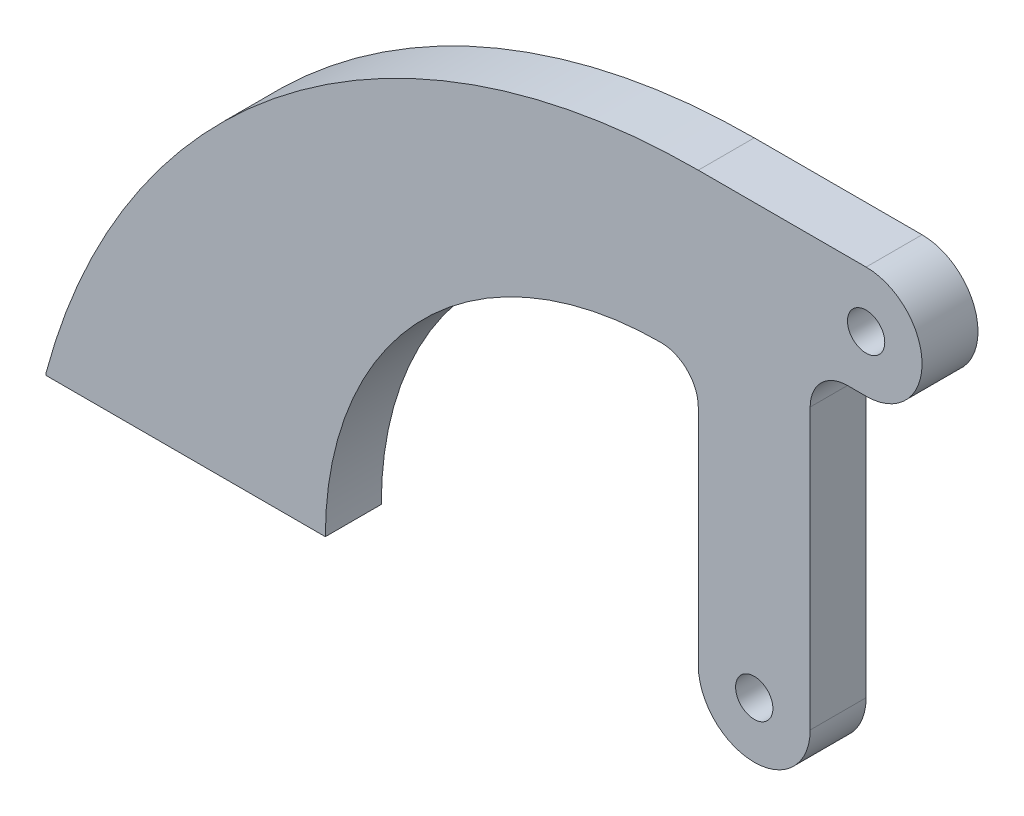
ISO-10303-21;
HEADER;
FILE_DESCRIPTION(('STEP AP214'),'2;1');
FILE_NAME('part.step','',(''),(''),'','','');
FILE_SCHEMA(('AUTOMOTIVE_DESIGN { 1 0 10303 214 1 1 1 1 }'));
ENDSEC;
DATA;
#1=APPLICATION_CONTEXT('core data for automotive mechanical design processes');
#2=APPLICATION_PROTOCOL_DEFINITION('international standard','automotive_design',2000,#1);
#3=PRODUCT_CONTEXT('',#1,'mechanical');
#4=PRODUCT('Part','Part','',(#3));
#5=PRODUCT_RELATED_PRODUCT_CATEGORY('part','',(#4));
#6=PRODUCT_DEFINITION_FORMATION('','',#4);
#7=PRODUCT_DEFINITION_CONTEXT('part definition',#1,'design');
#8=PRODUCT_DEFINITION('design','',#6,#7);
#9=PRODUCT_DEFINITION_SHAPE('','',#8);
#10=(LENGTH_UNIT() NAMED_UNIT(*) SI_UNIT(.MILLI.,.METRE.));
#11=(NAMED_UNIT(*) PLANE_ANGLE_UNIT() SI_UNIT($,.RADIAN.));
#12=(NAMED_UNIT(*) SI_UNIT($,.STERADIAN.) SOLID_ANGLE_UNIT());
#13=UNCERTAINTY_MEASURE_WITH_UNIT(LENGTH_MEASURE(1.E-05),#10,'distance_accuracy_value','');
#14=(GEOMETRIC_REPRESENTATION_CONTEXT(3) GLOBAL_UNCERTAINTY_ASSIGNED_CONTEXT((#13)) GLOBAL_UNIT_ASSIGNED_CONTEXT((#10,
#11,#12)) REPRESENTATION_CONTEXT('',''));
#15=CARTESIAN_POINT('',(0.,0.,0.));
#16=DIRECTION('',(0.,0.,1.));
#17=DIRECTION('',(1.,0.,0.));
#18=AXIS2_PLACEMENT_3D('',#15,#16,#17);
#19=CARTESIAN_POINT('',(11.,27.,0.));
#20=DIRECTION('',(0.,0.,1.));
#21=DIRECTION('',(0.,-1.,0.));
#22=AXIS2_PLACEMENT_3D('',#19,#20,#21);
#23=CYLINDRICAL_SURFACE('',#22,3.);
#24=CARTESIAN_POINT('',(11.,27.,0.));
#25=DIRECTION('',(0.,0.,1.));
#26=DIRECTION('',(0.,-1.,0.));
#27=AXIS2_PLACEMENT_3D('',#24,#25,#26);
#28=CIRCLE('',#27,3.);
#29=CARTESIAN_POINT('',(11.,24.,0.));
#30=VERTEX_POINT('',#29);
#31=CARTESIAN_POINT('',(11.,30.,0.));
#32=VERTEX_POINT('',#31);
#33=EDGE_CURVE('E147',#30,#32,#28,.T.);
#34=ORIENTED_EDGE('',*,*,#33,.F.);
#35=DIRECTION('',(0.,0.,-1.));
#36=VECTOR('',#35,1.);
#37=CARTESIAN_POINT('',(11.,24.,0.));
#38=LINE('',#37,#36);
#39=CARTESIAN_POINT('',(11.,24.,-3.));
#40=VERTEX_POINT('',#39);
#41=EDGE_CURVE('E11',#30,#40,#38,.T.);
#42=ORIENTED_EDGE('',*,*,#41,.T.);
#43=CARTESIAN_POINT('',(11.,27.,-3.));
#44=DIRECTION('',(0.,0.,-1.));
#45=DIRECTION('',(0.,-1.,0.));
#46=AXIS2_PLACEMENT_3D('',#43,#44,#45);
#47=CIRCLE('',#46,3.);
#48=CARTESIAN_POINT('',(11.,30.,-3.));
#49=VERTEX_POINT('',#48);
#50=EDGE_CURVE('E193',#49,#40,#47,.T.);
#51=ORIENTED_EDGE('',*,*,#50,.F.);
#52=DIRECTION('',(0.,0.,-1.));
#53=VECTOR('',#52,1.);
#54=CARTESIAN_POINT('',(11.,30.,0.));
#55=LINE('',#54,#53);
#56=EDGE_CURVE('E184',#32,#49,#55,.T.);
#57=ORIENTED_EDGE('',*,*,#56,.F.);
#58=EDGE_LOOP('',(#34,#42,#51,#57));
#59=FACE_BOUND('',#58,.T.);
#60=ADVANCED_FACE('F40',(#59),#23,.T.);
#61=CARTESIAN_POINT('',(11.,24.,0.));
#62=DIRECTION('',(0.,-1.,0.));
#63=DIRECTION('',(-1.,0.,0.));
#64=AXIS2_PLACEMENT_3D('',#61,#62,#63);
#65=PLANE('',#64);
#66=DIRECTION('',(1.,0.,0.));
#67=VECTOR('',#66,1.);
#68=CARTESIAN_POINT('',(10.,24.,0.));
#69=LINE('',#68,#67);
#70=CARTESIAN_POINT('',(10.,24.,0.));
#71=VERTEX_POINT('',#70);
#72=EDGE_CURVE('E142',#71,#30,#69,.T.);
#73=ORIENTED_EDGE('',*,*,#72,.F.);
#74=DIRECTION('',(0.,0.,-1.));
#75=VECTOR('',#74,1.);
#76=CARTESIAN_POINT('',(10.,24.,0.));
#77=LINE('',#76,#75);
#78=CARTESIAN_POINT('',(10.,24.,-3.));
#79=VERTEX_POINT('',#78);
#80=EDGE_CURVE('E52',#71,#79,#77,.T.);
#81=ORIENTED_EDGE('',*,*,#80,.T.);
#82=DIRECTION('',(-1.,0.,0.));
#83=VECTOR('',#82,1.);
#84=CARTESIAN_POINT('',(10.,24.,-3.));
#85=LINE('',#84,#83);
#86=EDGE_CURVE('E197',#40,#79,#85,.T.);
#87=ORIENTED_EDGE('',*,*,#86,.F.);
#88=ORIENTED_EDGE('',*,*,#41,.F.);
#89=EDGE_LOOP('',(#73,#81,#87,#88));
#90=FACE_BOUND('',#89,.T.);
#91=ADVANCED_FACE('F143',(#90),#65,.T.);
#92=CARTESIAN_POINT('',(10.,22.,0.));
#93=DIRECTION('',(0.,0.,1.));
#94=DIRECTION('',(0.,-1.,0.));
#95=AXIS2_PLACEMENT_3D('',#92,#93,#94);
#96=CYLINDRICAL_SURFACE('',#95,2.);
#97=CARTESIAN_POINT('',(10.,22.,0.));
#98=DIRECTION('',(0.,0.,-1.));
#99=DIRECTION('',(0.,-1.,0.));
#100=AXIS2_PLACEMENT_3D('',#97,#98,#99);
#101=CIRCLE('',#100,2.);
#102=CARTESIAN_POINT('',(8.,22.,0.));
#103=VERTEX_POINT('',#102);
#104=EDGE_CURVE('E133',#103,#71,#101,.T.);
#105=ORIENTED_EDGE('',*,*,#104,.F.);
#106=DIRECTION('',(0.,0.,-1.));
#107=VECTOR('',#106,1.);
#108=CARTESIAN_POINT('',(8.,22.,0.));
#109=LINE('',#108,#107);
#110=CARTESIAN_POINT('',(8.,22.,-3.));
#111=VERTEX_POINT('',#110);
#112=EDGE_CURVE('E215',#103,#111,#109,.T.);
#113=ORIENTED_EDGE('',*,*,#112,.T.);
#114=CARTESIAN_POINT('',(10.,22.,-3.));
#115=DIRECTION('',(0.,0.,1.));
#116=DIRECTION('',(0.,-1.,0.));
#117=AXIS2_PLACEMENT_3D('',#114,#115,#116);
#118=CIRCLE('',#117,2.);
#119=EDGE_CURVE('E137',#79,#111,#118,.T.);
#120=ORIENTED_EDGE('',*,*,#119,.F.);
#121=ORIENTED_EDGE('',*,*,#80,.F.);
#122=EDGE_LOOP('',(#105,#113,#120,#121));
#123=FACE_BOUND('',#122,.T.);
#124=ADVANCED_FACE('F130',(#123),#96,.F.);
#125=CARTESIAN_POINT('',(2.,6.,0.));
#126=DIRECTION('',(-1.,0.,0.));
#127=DIRECTION('',(0.,1.,0.));
#128=AXIS2_PLACEMENT_3D('',#125,#126,#127);
#129=PLANE('',#128);
#130=DIRECTION('',(0.,0.,1.));
#131=VECTOR('',#130,1.);
#132=CARTESIAN_POINT('',(2.,7.,0.));
#133=LINE('',#132,#131);
#134=CARTESIAN_POINT('',(2.,7.,-3.));
#135=VERTEX_POINT('',#134);
#136=CARTESIAN_POINT('',(2.,7.,0.));
#137=VERTEX_POINT('',#136);
#138=EDGE_CURVE('E192',#135,#137,#133,.T.);
#139=ORIENTED_EDGE('',*,*,#138,.T.);
#140=DIRECTION('',(0.,-1.,0.));
#141=VECTOR('',#140,1.);
#142=CARTESIAN_POINT('',(2.,16.,0.));
#143=LINE('',#142,#141);
#144=CARTESIAN_POINT('',(2.,16.,0.));
#145=VERTEX_POINT('',#144);
#146=EDGE_CURVE('E160',#145,#137,#143,.T.);
#147=ORIENTED_EDGE('',*,*,#146,.F.);
#148=DIRECTION('',(0.,0.,-1.));
#149=VECTOR('',#148,1.);
#150=CARTESIAN_POINT('',(2.,16.,0.));
#151=LINE('',#150,#149);
#152=CARTESIAN_POINT('',(2.,16.,-3.));
#153=VERTEX_POINT('',#152);
#154=EDGE_CURVE('E79',#145,#153,#151,.T.);
#155=ORIENTED_EDGE('',*,*,#154,.T.);
#156=DIRECTION('',(0.,1.,0.));
#157=VECTOR('',#156,1.);
#158=CARTESIAN_POINT('',(2.,16.,-3.));
#159=LINE('',#158,#157);
#160=EDGE_CURVE('E201',#135,#153,#159,.T.);
#161=ORIENTED_EDGE('',*,*,#160,.F.);
#162=EDGE_LOOP('',(#139,#147,#155,#161));
#163=FACE_BOUND('',#162,.T.);
#164=ADVANCED_FACE('F352',(#163),#129,.T.);
#165=CARTESIAN_POINT('',(0.,16.,0.));
#166=DIRECTION('',(0.,0.,1.));
#167=DIRECTION('',(-1.,0.,0.));
#168=AXIS2_PLACEMENT_3D('',#165,#166,#167);
#169=CYLINDRICAL_SURFACE('',#168,2.);
#170=DIRECTION('',(0.,0.,-1.));
#171=VECTOR('',#170,1.);
#172=CARTESIAN_POINT('',(1.99998275016979,16.0083065650722,0.));
#173=LINE('',#172,#171);
#174=CARTESIAN_POINT('',(1.99998275016979,16.0083065650722,0.));
#175=VERTEX_POINT('',#174);
#176=CARTESIAN_POINT('',(1.99998275016979,16.0083065650722,-3.));
#177=VERTEX_POINT('',#176);
#178=EDGE_CURVE('E90',#175,#177,#173,.T.);
#179=ORIENTED_EDGE('',*,*,#178,.T.);
#180=CARTESIAN_POINT('',(0.,16.,-3.));
#181=DIRECTION('',(0.,0.,1.));
#182=DIRECTION('',(-1.,0.,0.));
#183=AXIS2_PLACEMENT_3D('',#180,#181,#182);
#184=CIRCLE('',#183,2.);
#185=EDGE_CURVE('E205',#153,#177,#184,.T.);
#186=ORIENTED_EDGE('',*,*,#185,.F.);
#187=ORIENTED_EDGE('',*,*,#154,.F.);
#188=CARTESIAN_POINT('',(0.,16.,0.));
#189=DIRECTION('',(0.,0.,-1.));
#190=DIRECTION('',(-1.,0.,0.));
#191=AXIS2_PLACEMENT_3D('',#188,#189,#190);
#192=CIRCLE('',#191,2.);
#193=EDGE_CURVE('E245',#175,#145,#192,.T.);
#194=ORIENTED_EDGE('',*,*,#193,.F.);
#195=EDGE_LOOP('',(#179,#186,#187,#194));
#196=FACE_BOUND('',#195,.T.);
#197=ADVANCED_FACE('F353',(#196),#169,.F.);
#198=CARTESIAN_POINT('',(2.,-6.19,0.));
#199=DIRECTION('',(0.,0.,1.));
#200=DIRECTION('',(0.,1.,0.));
#201=AXIS2_PLACEMENT_3D('',#198,#199,#200);
#202=CYLINDRICAL_SURFACE('',#201,36.19);
#203=DIRECTION('',(0.,0.,1.));
#204=VECTOR('',#203,1.);
#205=CARTESIAN_POINT('',(-32.9805780356653,3.08767537105762,0.));
#206=LINE('',#205,#204);
#207=CARTESIAN_POINT('',(-32.9805780356653,3.08767537105763,0.));
#208=VERTEX_POINT('',#207);
#209=CARTESIAN_POINT('',(-32.9805780356653,3.08767537105763,-3.));
#210=VERTEX_POINT('',#209);
#211=EDGE_CURVE('E213',#208,#210,#206,.F.);
#212=ORIENTED_EDGE('',*,*,#211,.F.);
#213=CARTESIAN_POINT('',(2.,-6.19,0.));
#214=DIRECTION('',(0.,0.,1.));
#215=DIRECTION('',(0.,1.,0.));
#216=AXIS2_PLACEMENT_3D('',#213,#214,#215);
#217=CIRCLE('',#216,36.19);
#218=CARTESIAN_POINT('',(2.,30.,0.));
#219=VERTEX_POINT('',#218);
#220=EDGE_CURVE('E166',#219,#208,#217,.T.);
#221=ORIENTED_EDGE('',*,*,#220,.F.);
#222=DIRECTION('',(0.,0.,-1.));
#223=VECTOR('',#222,1.);
#224=CARTESIAN_POINT('',(2.,30.,0.));
#225=LINE('',#224,#223);
#226=CARTESIAN_POINT('',(2.,30.,-3.));
#227=VERTEX_POINT('',#226);
#228=EDGE_CURVE('E180',#219,#227,#225,.T.);
#229=ORIENTED_EDGE('',*,*,#228,.T.);
#230=CARTESIAN_POINT('',(2.,-6.19,-3.));
#231=DIRECTION('',(0.,0.,-1.));
#232=DIRECTION('',(0.,1.,0.));
#233=AXIS2_PLACEMENT_3D('',#230,#231,#232);
#234=CIRCLE('',#233,36.19);
#235=EDGE_CURVE('E174',#210,#227,#234,.T.);
#236=ORIENTED_EDGE('',*,*,#235,.F.);
#237=EDGE_LOOP('',(#212,#221,#229,#236));
#238=FACE_BOUND('',#237,.T.);
#239=ADVANCED_FACE('F327',(#238),#202,.T.);
#240=CARTESIAN_POINT('',(2.,30.,0.));
#241=DIRECTION('',(0.,1.,0.));
#242=DIRECTION('',(1.,0.,0.));
#243=AXIS2_PLACEMENT_3D('',#240,#241,#242);
#244=PLANE('',#243);
#245=DIRECTION('',(-1.,0.,0.));
#246=VECTOR('',#245,1.);
#247=CARTESIAN_POINT('',(11.,30.,0.));
#248=LINE('',#247,#246);
#249=EDGE_CURVE('E169',#32,#219,#248,.T.);
#250=ORIENTED_EDGE('',*,*,#249,.F.);
#251=ORIENTED_EDGE('',*,*,#56,.T.);
#252=DIRECTION('',(1.,0.,0.));
#253=VECTOR('',#252,1.);
#254=CARTESIAN_POINT('',(11.,30.,-3.));
#255=LINE('',#254,#253);
#256=EDGE_CURVE('E179',#227,#49,#255,.T.);
#257=ORIENTED_EDGE('',*,*,#256,.F.);
#258=ORIENTED_EDGE('',*,*,#228,.F.);
#259=EDGE_LOOP('',(#250,#251,#257,#258));
#260=FACE_BOUND('',#259,.T.);
#261=ADVANCED_FACE('F332',(#260),#244,.T.);
#262=CARTESIAN_POINT('',(11.,27.,0.));
#263=DIRECTION('',(0.,0.,1.));
#264=DIRECTION('',(-1.,0.,0.));
#265=AXIS2_PLACEMENT_3D('',#262,#263,#264);
#266=CYLINDRICAL_SURFACE('',#265,1.);
#267=CARTESIAN_POINT('',(11.,27.,0.));
#268=DIRECTION('',(0.,0.,-1.));
#269=DIRECTION('',(-1.,0.,0.));
#270=AXIS2_PLACEMENT_3D('',#267,#268,#269);
#271=CIRCLE('',#270,1.);
#272=CARTESIAN_POINT('',(12.,27.,0.));
#273=VERTEX_POINT('',#272);
#274=EDGE_CURVE('E168',#273,#273,#271,.T.);
#275=ORIENTED_EDGE('',*,*,#274,.F.);
#276=EDGE_LOOP('',(#275));
#277=FACE_BOUND('',#276,.T.);
#278=CARTESIAN_POINT('',(11.,27.,-3.));
#279=DIRECTION('',(0.,0.,1.));
#280=DIRECTION('',(-1.,0.,0.));
#281=AXIS2_PLACEMENT_3D('',#278,#279,#280);
#282=CIRCLE('',#281,1.);
#283=CARTESIAN_POINT('',(12.,27.,-3.));
#284=VERTEX_POINT('',#283);
#285=EDGE_CURVE('E175',#284,#284,#282,.T.);
#286=ORIENTED_EDGE('',*,*,#285,.F.);
#287=EDGE_LOOP('',(#286));
#288=FACE_BOUND('',#287,.T.);
#289=ADVANCED_FACE('F382',(#277,#288),#266,.F.);
#290=CARTESIAN_POINT('',(-6.41871882567347E-05,18.9951777966219,0.));
#291=DIRECTION('',(0.,0.,1.));
#292=DIRECTION('',(1.,-9.96623819746638E-12,0.));
#293=AXIS2_PLACEMENT_3D('',#290,#291,#292);
#294=CYLINDRICAL_SURFACE('',#293,2.00004693738782);
#295=CARTESIAN_POINT('',(-6.41871882567347E-05,18.9951777966219,-3.));
#296=DIRECTION('',(0.,0.,1.));
#297=DIRECTION('',(1.,-9.96623819746638E-12,0.));
#298=AXIS2_PLACEMENT_3D('',#295,#296,#297);
#299=CIRCLE('',#298,2.00004693738782);
#300=CARTESIAN_POINT('',(1.99998275019956,18.995177796602,-3.));
#301=VERTEX_POINT('',#300);
#302=CARTESIAN_POINT('',(0.0128706134629569,20.995182907287,-3.));
#303=VERTEX_POINT('',#302);
#304=EDGE_CURVE('E185',#301,#303,#299,.T.);
#305=ORIENTED_EDGE('',*,*,#304,.F.);
#306=DIRECTION('',(0.,0.,-1.));
#307=VECTOR('',#306,1.);
#308=CARTESIAN_POINT('',(1.99998275019956,18.995177796602,0.));
#309=LINE('',#308,#307);
#310=CARTESIAN_POINT('',(1.99998275019956,18.995177796602,0.));
#311=VERTEX_POINT('',#310);
#312=EDGE_CURVE('E240',#311,#301,#309,.T.);
#313=ORIENTED_EDGE('',*,*,#312,.F.);
#314=CARTESIAN_POINT('',(-6.41871882567347E-05,18.9951777966219,0.));
#315=DIRECTION('',(0.,0.,-1.));
#316=DIRECTION('',(1.,-9.96623819746638E-12,0.));
#317=AXIS2_PLACEMENT_3D('',#314,#315,#316);
#318=CIRCLE('',#317,2.00004693738782);
#319=CARTESIAN_POINT('',(0.0128706134629569,20.995182907287,0.));
#320=VERTEX_POINT('',#319);
#321=EDGE_CURVE('E191',#320,#311,#318,.T.);
#322=ORIENTED_EDGE('',*,*,#321,.F.);
#323=DIRECTION('',(0.,0.,-1.));
#324=VECTOR('',#323,1.);
#325=CARTESIAN_POINT('',(0.0128706134629569,20.995182907287,0.));
#326=LINE('',#325,#324);
#327=EDGE_CURVE('E219',#320,#303,#326,.T.);
#328=ORIENTED_EDGE('',*,*,#327,.T.);
#329=EDGE_LOOP('',(#305,#313,#322,#328));
#330=FACE_BOUND('',#329,.T.);
#331=ADVANCED_FACE('F42',(#330),#294,.F.);
#332=CARTESIAN_POINT('',(1.99998275019956,18.995177796602,0.));
#333=DIRECTION('',(1.,-9.96632671321048E-12,0.));
#334=DIRECTION('',(-9.96632671321048E-12,-1.,0.));
#335=AXIS2_PLACEMENT_3D('',#332,#333,#334);
#336=PLANE('',#335);
#337=DIRECTION('',(9.96632671321048E-12,1.,0.));
#338=VECTOR('',#337,1.);
#339=CARTESIAN_POINT('',(1.99998275017965,16.9981966981352,-3.));
#340=LINE('',#339,#338);
#341=EDGE_CURVE('E164',#177,#301,#340,.T.);
#342=ORIENTED_EDGE('',*,*,#341,.F.);
#343=ORIENTED_EDGE('',*,*,#178,.F.);
#344=DIRECTION('',(-9.96632671321048E-12,-1.,0.));
#345=VECTOR('',#344,1.);
#346=CARTESIAN_POINT('',(1.99998275017965,16.9981966981352,0.));
#347=LINE('',#346,#345);
#348=EDGE_CURVE('E235',#311,#175,#347,.T.);
#349=ORIENTED_EDGE('',*,*,#348,.F.);
#350=ORIENTED_EDGE('',*,*,#312,.T.);
#351=EDGE_LOOP('',(#342,#343,#349,#350));
#352=FACE_BOUND('',#351,.T.);
#353=ADVANCED_FACE('F276',(#352),#336,.F.);
#354=CARTESIAN_POINT('',(5.,6.995,0.));
#355=DIRECTION('',(0.,0.,1.));
#356=DIRECTION('',(1.,0.,0.));
#357=AXIS2_PLACEMENT_3D('',#354,#355,#356);
#358=CYLINDRICAL_SURFACE('',#357,1.);
#359=CARTESIAN_POINT('',(5.,6.995,0.));
#360=DIRECTION('',(0.,0.,-1.));
#361=DIRECTION('',(1.,0.,0.));
#362=AXIS2_PLACEMENT_3D('',#359,#360,#361);
#363=CIRCLE('',#362,1.);
#364=CARTESIAN_POINT('',(6.,6.995,0.));
#365=VERTEX_POINT('',#364);
#366=EDGE_CURVE('E59',#365,#365,#363,.T.);
#367=ORIENTED_EDGE('',*,*,#366,.F.);
#368=EDGE_LOOP('',(#367));
#369=FACE_BOUND('',#368,.T.);
#370=CARTESIAN_POINT('',(5.,6.995,-3.));
#371=DIRECTION('',(0.,0.,1.));
#372=DIRECTION('',(1.,0.,0.));
#373=AXIS2_PLACEMENT_3D('',#370,#371,#372);
#374=CIRCLE('',#373,1.);
#375=CARTESIAN_POINT('',(6.,6.995,-3.));
#376=VERTEX_POINT('',#375);
#377=EDGE_CURVE('E171',#376,#376,#374,.T.);
#378=ORIENTED_EDGE('',*,*,#377,.F.);
#379=EDGE_LOOP('',(#378));
#380=FACE_BOUND('',#379,.T.);
#381=ADVANCED_FACE('F375',(#369,#380),#358,.F.);
#382=CARTESIAN_POINT('',(8.,22.,0.));
#383=DIRECTION('',(1.,0.,0.));
#384=DIRECTION('',(0.,-1.,0.));
#385=AXIS2_PLACEMENT_3D('',#382,#383,#384);
#386=PLANE('',#385);
#387=DIRECTION('',(0.,0.,1.));
#388=VECTOR('',#387,1.);
#389=CARTESIAN_POINT('',(8.,7.,0.));
#390=LINE('',#389,#388);
#391=CARTESIAN_POINT('',(8.,7.,-3.));
#392=VERTEX_POINT('',#391);
#393=CARTESIAN_POINT('',(8.,7.,0.));
#394=VERTEX_POINT('',#393);
#395=EDGE_CURVE('E188',#392,#394,#390,.T.);
#396=ORIENTED_EDGE('',*,*,#395,.F.);
#397=DIRECTION('',(0.,-1.,0.));
#398=VECTOR('',#397,1.);
#399=CARTESIAN_POINT('',(8.,6.,-3.));
#400=LINE('',#399,#398);
#401=EDGE_CURVE('E239',#111,#392,#400,.T.);
#402=ORIENTED_EDGE('',*,*,#401,.F.);
#403=ORIENTED_EDGE('',*,*,#112,.F.);
#404=DIRECTION('',(0.,1.,0.));
#405=VECTOR('',#404,1.);
#406=CARTESIAN_POINT('',(8.,6.,0.));
#407=LINE('',#406,#405);
#408=EDGE_CURVE('E153',#394,#103,#407,.T.);
#409=ORIENTED_EDGE('',*,*,#408,.F.);
#410=EDGE_LOOP('',(#396,#402,#403,#409));
#411=FACE_BOUND('',#410,.T.);
#412=ADVANCED_FACE('F378',(#411),#386,.T.);
#413=CARTESIAN_POINT('',(-9.8281371421593,15.0012155997863,0.));
#414=DIRECTION('',(0.,0.,1.));
#415=DIRECTION('',(1.,0.,0.));
#416=AXIS2_PLACEMENT_3D('',#413,#414,#415);
#417=PLANE('',#416);
#418=CARTESIAN_POINT('',(-7.30788703140516E-05,2.99527072091607,0.));
#419=DIRECTION('',(0.,0.,-1.));
#420=DIRECTION('',(0.000719097340734425,0.999999741449474,0.));
#421=AXIS2_PLACEMENT_3D('',#418,#419,#420);
#422=CIRCLE('',#421,17.9999168402589);
#423=CARTESIAN_POINT('',(-17.9999804761627,2.97683311973031,0.));
#424=VERTEX_POINT('',#423);
#425=EDGE_CURVE('E44',#424,#320,#422,.T.);
#426=ORIENTED_EDGE('',*,*,#425,.T.);
#427=ORIENTED_EDGE('',*,*,#321,.T.);
#428=ORIENTED_EDGE('',*,*,#348,.T.);
#429=ORIENTED_EDGE('',*,*,#193,.T.);
#430=ORIENTED_EDGE('',*,*,#146,.T.);
#431=CARTESIAN_POINT('',(5.,7.,0.));
#432=DIRECTION('',(0.,0.,1.));
#433=DIRECTION('',(-1.,0.,0.));
#434=AXIS2_PLACEMENT_3D('',#431,#432,#433);
#435=CIRCLE('',#434,3.);
#436=EDGE_CURVE('E186',#137,#394,#435,.T.);
#437=ORIENTED_EDGE('',*,*,#436,.T.);
#438=ORIENTED_EDGE('',*,*,#408,.T.);
#439=ORIENTED_EDGE('',*,*,#104,.T.);
#440=ORIENTED_EDGE('',*,*,#72,.T.);
#441=ORIENTED_EDGE('',*,*,#33,.T.);
#442=ORIENTED_EDGE('',*,*,#249,.T.);
#443=ORIENTED_EDGE('',*,*,#220,.T.);
#444=DIRECTION('',(0.,-1.,0.));
#445=VECTOR('',#444,1.);
#446=CARTESIAN_POINT('',(-32.9805780356653,18.2673661169037,0.));
#447=LINE('',#446,#445);
#448=CARTESIAN_POINT('',(-32.9805780356653,2.97594469312184,0.));
#449=VERTEX_POINT('',#448);
#450=EDGE_CURVE('E319',#208,#449,#447,.T.);
#451=ORIENTED_EDGE('',*,*,#450,.T.);
#452=DIRECTION('',(-1.,0.,0.));
#453=VECTOR('',#452,1.);
#454=CARTESIAN_POINT('',(-17.9999804761627,2.97594469312184,0.));
#455=LINE('',#454,#453);
#456=CARTESIAN_POINT('',(-17.9999804761627,2.97594469312184,0.));
#457=VERTEX_POINT('',#456);
#458=EDGE_CURVE('E323',#457,#449,#455,.T.);
#459=ORIENTED_EDGE('',*,*,#458,.F.);
#460=DIRECTION('',(0.,-1.,0.));
#461=VECTOR('',#460,1.);
#462=CARTESIAN_POINT('',(-17.9999804761627,2.97594469312184,0.));
#463=LINE('',#462,#461);
#464=EDGE_CURVE('E259',#424,#457,#463,.T.);
#465=ORIENTED_EDGE('',*,*,#464,.F.);
#466=EDGE_LOOP('',(#426,#427,#428,#429,#430,#437,#438,#439,#440,#441,#442,#443,#451,#459,#465));
#467=FACE_BOUND('',#466,.T.);
#468=ORIENTED_EDGE('',*,*,#366,.T.);
#469=EDGE_LOOP('',(#468));
#470=FACE_BOUND('',#469,.T.);
#471=ORIENTED_EDGE('',*,*,#274,.T.);
#472=EDGE_LOOP('',(#471));
#473=FACE_BOUND('',#472,.T.);
#474=ADVANCED_FACE('F150',(#467,#470,#473),#417,.T.);
#475=CARTESIAN_POINT('',(5.,7.,0.));
#476=DIRECTION('',(0.,0.,1.));
#477=DIRECTION('',(-1.,0.,0.));
#478=AXIS2_PLACEMENT_3D('',#475,#476,#477);
#479=CYLINDRICAL_SURFACE('',#478,3.);
#480=ORIENTED_EDGE('',*,*,#436,.F.);
#481=ORIENTED_EDGE('',*,*,#138,.F.);
#482=CARTESIAN_POINT('',(5.,7.,-3.));
#483=DIRECTION('',(0.,0.,-1.));
#484=DIRECTION('',(-1.,0.,0.));
#485=AXIS2_PLACEMENT_3D('',#482,#483,#484);
#486=CIRCLE('',#485,3.);
#487=EDGE_CURVE('E206',#392,#135,#486,.T.);
#488=ORIENTED_EDGE('',*,*,#487,.F.);
#489=ORIENTED_EDGE('',*,*,#395,.T.);
#490=EDGE_LOOP('',(#480,#481,#488,#489));
#491=FACE_BOUND('',#490,.T.);
#492=ADVANCED_FACE('F350',(#491),#479,.T.);
#493=CARTESIAN_POINT('',(-9.8281371421593,15.0012155997863,-3.));
#494=DIRECTION('',(0.,0.,1.));
#495=DIRECTION('',(1.,0.,0.));
#496=AXIS2_PLACEMENT_3D('',#493,#494,#495);
#497=PLANE('',#496);
#498=CARTESIAN_POINT('',(-7.30788703140516E-05,2.99527072091607,-3.));
#499=DIRECTION('',(0.,0.,1.));
#500=DIRECTION('',(0.000719097340734425,0.999999741449474,0.));
#501=AXIS2_PLACEMENT_3D('',#498,#499,#500);
#502=CIRCLE('',#501,17.9999168402589);
#503=CARTESIAN_POINT('',(-17.9999804761627,2.97683311973031,-3.));
#504=VERTEX_POINT('',#503);
#505=EDGE_CURVE('E212',#303,#504,#502,.T.);
#506=ORIENTED_EDGE('',*,*,#505,.T.);
#507=DIRECTION('',(0.,1.,0.));
#508=VECTOR('',#507,1.);
#509=CARTESIAN_POINT('',(-17.9999804761627,2.97594469312184,-3.));
#510=LINE('',#509,#508);
#511=CARTESIAN_POINT('',(-17.9999804761627,2.97594469312184,-3.));
#512=VERTEX_POINT('',#511);
#513=EDGE_CURVE('E274',#512,#504,#510,.T.);
#514=ORIENTED_EDGE('',*,*,#513,.F.);
#515=DIRECTION('',(-1.,0.,0.));
#516=VECTOR('',#515,1.);
#517=CARTESIAN_POINT('',(-17.9999804761627,2.97594469312184,-3.));
#518=LINE('',#517,#516);
#519=CARTESIAN_POINT('',(-32.9805780356653,2.97594469312184,-3.));
#520=VERTEX_POINT('',#519);
#521=EDGE_CURVE('E325',#512,#520,#518,.T.);
#522=ORIENTED_EDGE('',*,*,#521,.T.);
#523=DIRECTION('',(0.,-1.,0.));
#524=VECTOR('',#523,1.);
#525=CARTESIAN_POINT('',(-32.9805780356653,18.2673661169037,-3.));
#526=LINE('',#525,#524);
#527=EDGE_CURVE('E316',#210,#520,#526,.T.);
#528=ORIENTED_EDGE('',*,*,#527,.F.);
#529=ORIENTED_EDGE('',*,*,#235,.T.);
#530=ORIENTED_EDGE('',*,*,#256,.T.);
#531=ORIENTED_EDGE('',*,*,#50,.T.);
#532=ORIENTED_EDGE('',*,*,#86,.T.);
#533=ORIENTED_EDGE('',*,*,#119,.T.);
#534=ORIENTED_EDGE('',*,*,#401,.T.);
#535=ORIENTED_EDGE('',*,*,#487,.T.);
#536=ORIENTED_EDGE('',*,*,#160,.T.);
#537=ORIENTED_EDGE('',*,*,#185,.T.);
#538=ORIENTED_EDGE('',*,*,#341,.T.);
#539=ORIENTED_EDGE('',*,*,#304,.T.);
#540=EDGE_LOOP('',(#506,#514,#522,#528,#529,#530,#531,#532,#533,#534,#535,#536,#537,#538,#539));
#541=FACE_BOUND('',#540,.T.);
#542=ORIENTED_EDGE('',*,*,#285,.T.);
#543=EDGE_LOOP('',(#542));
#544=FACE_BOUND('',#543,.T.);
#545=ORIENTED_EDGE('',*,*,#377,.T.);
#546=EDGE_LOOP('',(#545));
#547=FACE_BOUND('',#546,.T.);
#548=ADVANCED_FACE('F271',(#541,#544,#547),#497,.F.);
#549=CARTESIAN_POINT('',(-7.30788703140516E-05,2.99527072091607,0.));
#550=DIRECTION('',(0.,0.,1.));
#551=DIRECTION('',(0.000719097340734424,0.999999741449474,0.));
#552=AXIS2_PLACEMENT_3D('',#549,#550,#551);
#553=CYLINDRICAL_SURFACE('',#552,17.9999168402589);
#554=ORIENTED_EDGE('',*,*,#327,.F.);
#555=ORIENTED_EDGE('',*,*,#425,.F.);
#556=DIRECTION('',(0.,0.,-1.));
#557=VECTOR('',#556,1.);
#558=CARTESIAN_POINT('',(-17.9999804761627,2.97683311973031,0.));
#559=LINE('',#558,#557);
#560=EDGE_CURVE('E209',#424,#504,#559,.T.);
#561=ORIENTED_EDGE('',*,*,#560,.T.);
#562=ORIENTED_EDGE('',*,*,#505,.F.);
#563=EDGE_LOOP('',(#554,#555,#561,#562));
#564=FACE_BOUND('',#563,.T.);
#565=ADVANCED_FACE('F267',(#564),#553,.F.);
#566=CARTESIAN_POINT('',(-17.9999804761627,0.,0.));
#567=DIRECTION('',(1.,0.,0.));
#568=DIRECTION('',(0.,0.,-1.));
#569=AXIS2_PLACEMENT_3D('',#566,#567,#568);
#570=PLANE('',#569);
#571=ORIENTED_EDGE('',*,*,#560,.F.);
#572=ORIENTED_EDGE('',*,*,#464,.T.);
#573=DIRECTION('',(0.,0.,-1.));
#574=VECTOR('',#573,1.);
#575=CARTESIAN_POINT('',(-17.9999804761627,2.97594469312184,-3.));
#576=LINE('',#575,#574);
#577=EDGE_CURVE('E296',#457,#512,#576,.T.);
#578=ORIENTED_EDGE('',*,*,#577,.T.);
#579=ORIENTED_EDGE('',*,*,#513,.T.);
#580=EDGE_LOOP('',(#571,#572,#578,#579));
#581=FACE_BOUND('',#580,.T.);
#582=ADVANCED_FACE('F374',(#581),#570,.T.);
#583=CARTESIAN_POINT('',(-17.9999804761627,2.97594469312184,-3.));
#584=DIRECTION('',(0.,1.,0.));
#585=DIRECTION('',(0.,0.,1.));
#586=AXIS2_PLACEMENT_3D('',#583,#584,#585);
#587=PLANE('',#586);
#588=ORIENTED_EDGE('',*,*,#458,.T.);
#589=DIRECTION('',(0.,0.,-1.));
#590=VECTOR('',#589,1.);
#591=CARTESIAN_POINT('',(-32.9805780356653,2.97594469312184,0.));
#592=LINE('',#591,#590);
#593=EDGE_CURVE('E605',#449,#520,#592,.T.);
#594=ORIENTED_EDGE('',*,*,#593,.T.);
#595=ORIENTED_EDGE('',*,*,#521,.F.);
#596=ORIENTED_EDGE('',*,*,#577,.F.);
#597=EDGE_LOOP('',(#588,#594,#595,#596));
#598=FACE_BOUND('',#597,.T.);
#599=ADVANCED_FACE('F409',(#598),#587,.F.);
#600=CARTESIAN_POINT('',(-32.9805780356653,18.2673661169037,0.));
#601=DIRECTION('',(-1.,0.,0.));
#602=DIRECTION('',(0.,0.,1.));
#603=AXIS2_PLACEMENT_3D('',#600,#601,#602);
#604=PLANE('',#603);
#605=ORIENTED_EDGE('',*,*,#450,.F.);
#606=ORIENTED_EDGE('',*,*,#211,.T.);
#607=ORIENTED_EDGE('',*,*,#527,.T.);
#608=ORIENTED_EDGE('',*,*,#593,.F.);
#609=EDGE_LOOP('',(#605,#606,#607,#608));
#610=FACE_BOUND('',#609,.T.);
#611=ADVANCED_FACE('F314',(#610),#604,.T.);
#612=CLOSED_SHELL('',(#60,#91,#124,#164,#197,#239,#261,#289,#331,#353,#381,#412,#474,#492,#548,
#565,#582,#599,#611));
#613=MANIFOLD_SOLID_BREP('B2',#612);
#614=ADVANCED_BREP_SHAPE_REPRESENTATION('',(#18,#613),#14);
#615=SHAPE_DEFINITION_REPRESENTATION(#9,#614);
ENDSEC;
END-ISO-10303-21;
